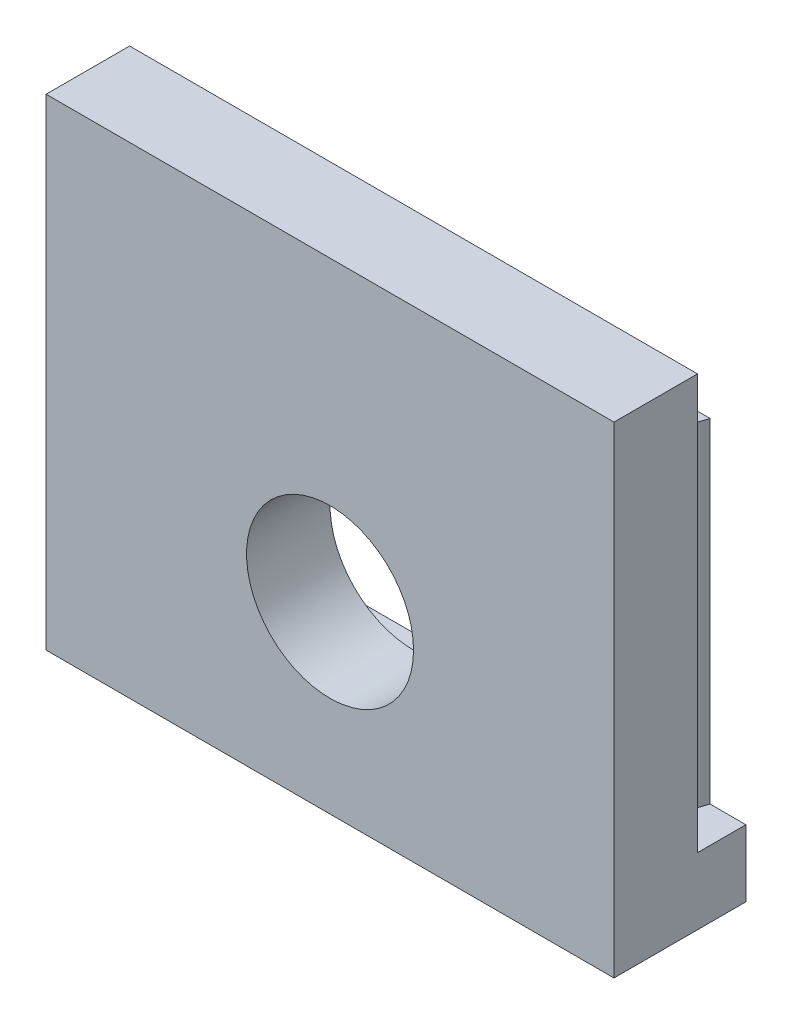
ISO-10303-21;
HEADER;
FILE_DESCRIPTION(('STEP AP214'),'2;1');
FILE_NAME('part.step','',(''),(''),'','','');
FILE_SCHEMA(('AUTOMOTIVE_DESIGN { 1 0 10303 214 1 1 1 1 }'));
ENDSEC;
DATA;
#1=APPLICATION_CONTEXT('core data for automotive mechanical design processes');
#2=APPLICATION_PROTOCOL_DEFINITION('international standard','automotive_design',2000,#1);
#3=PRODUCT_CONTEXT('',#1,'mechanical');
#4=PRODUCT('Part','Part','',(#3));
#5=PRODUCT_RELATED_PRODUCT_CATEGORY('part','',(#4));
#6=PRODUCT_DEFINITION_FORMATION('','',#4);
#7=PRODUCT_DEFINITION_CONTEXT('part definition',#1,'design');
#8=PRODUCT_DEFINITION('design','',#6,#7);
#9=PRODUCT_DEFINITION_SHAPE('','',#8);
#10=(LENGTH_UNIT() NAMED_UNIT(*) SI_UNIT(.MILLI.,.METRE.));
#11=(NAMED_UNIT(*) PLANE_ANGLE_UNIT() SI_UNIT($,.RADIAN.));
#12=(NAMED_UNIT(*) SI_UNIT($,.STERADIAN.) SOLID_ANGLE_UNIT());
#13=UNCERTAINTY_MEASURE_WITH_UNIT(LENGTH_MEASURE(1.E-05),#10,'distance_accuracy_value','');
#14=(GEOMETRIC_REPRESENTATION_CONTEXT(3) GLOBAL_UNCERTAINTY_ASSIGNED_CONTEXT((#13)) GLOBAL_UNIT_ASSIGNED_CONTEXT((#10,
#11,#12)) REPRESENTATION_CONTEXT('',''));
#15=CARTESIAN_POINT('',(0.,0.,0.));
#16=DIRECTION('',(0.,0.,1.));
#17=DIRECTION('',(1.,0.,0.));
#18=AXIS2_PLACEMENT_3D('',#15,#16,#17);
#19=CARTESIAN_POINT('',(-20.,-26.,-5.));
#20=DIRECTION('',(0.,-1.,0.));
#21=DIRECTION('',(0.,0.,-1.));
#22=AXIS2_PLACEMENT_3D('',#19,#20,#21);
#23=PLANE('',#22);
#24=DIRECTION('',(1.,0.,0.));
#25=VECTOR('',#24,1.);
#26=CARTESIAN_POINT('',(-20.,-26.,0.));
#27=LINE('',#26,#25);
#28=CARTESIAN_POINT('',(-17.0050160964288,-26.,0.));
#29=VERTEX_POINT('',#28);
#30=CARTESIAN_POINT('',(17.0050160964288,-26.,0.));
#31=VERTEX_POINT('',#30);
#32=EDGE_CURVE('E281',#29,#31,#27,.T.);
#33=ORIENTED_EDGE('',*,*,#32,.F.);
#34=DIRECTION('',(0.,0.,-1.));
#35=VECTOR('',#34,1.);
#36=CARTESIAN_POINT('',(-17.0050160964288,-26.,-5.));
#37=LINE('',#36,#35);
#38=CARTESIAN_POINT('',(-17.0050160964288,-26.,-7.90000000000003));
#39=VERTEX_POINT('',#38);
#40=EDGE_CURVE('E148',#29,#39,#37,.T.);
#41=ORIENTED_EDGE('',*,*,#40,.T.);
#42=DIRECTION('',(1.,0.,0.));
#43=VECTOR('',#42,1.);
#44=CARTESIAN_POINT('',(-20.,-26.,-7.90000000000003));
#45=LINE('',#44,#43);
#46=CARTESIAN_POINT('',(17.0050160964288,-26.,-7.90000000000003));
#47=VERTEX_POINT('',#46);
#48=EDGE_CURVE('E193',#39,#47,#45,.T.);
#49=ORIENTED_EDGE('',*,*,#48,.T.);
#50=DIRECTION('',(0.,0.,1.));
#51=VECTOR('',#50,1.);
#52=CARTESIAN_POINT('',(17.0050160964288,-26.,-5.));
#53=LINE('',#52,#51);
#54=EDGE_CURVE('E55',#47,#31,#53,.T.);
#55=ORIENTED_EDGE('',*,*,#54,.T.);
#56=EDGE_LOOP('',(#33,#41,#49,#55));
#57=FACE_BOUND('',#56,.T.);
#58=ADVANCED_FACE('F40',(#57),#23,.T.);
#59=CARTESIAN_POINT('',(17.2528036070203,-22.,-60.));
#60=DIRECTION('',(0.,-1.,0.));
#61=DIRECTION('',(1.,0.,0.));
#62=AXIS2_PLACEMENT_3D('',#59,#60,#61);
#63=PLANE('',#62);
#64=DIRECTION('',(0.,0.,-1.));
#65=VECTOR('',#64,1.);
#66=CARTESIAN_POINT('',(-17.0050160964288,-22.,-60.));
#67=LINE('',#66,#65);
#68=CARTESIAN_POINT('',(-17.0050160964288,-22.,-5.));
#69=VERTEX_POINT('',#68);
#70=CARTESIAN_POINT('',(-17.0050160964288,-22.,-7.90000000000003));
#71=VERTEX_POINT('',#70);
#72=EDGE_CURVE('E186',#69,#71,#67,.T.);
#73=ORIENTED_EDGE('',*,*,#72,.F.);
#74=DIRECTION('',(1.,0.,0.));
#75=VECTOR('',#74,1.);
#76=CARTESIAN_POINT('',(17.2528036070203,-22.,-5.));
#77=LINE('',#76,#75);
#78=CARTESIAN_POINT('',(-13.8945907446611,-22.,-5.00000000000003));
#79=VERTEX_POINT('',#78);
#80=EDGE_CURVE('E272',#69,#79,#77,.T.);
#81=ORIENTED_EDGE('',*,*,#80,.T.);
#82=DIRECTION('',(0.316227766016838,0.,0.948683298050514));
#83=VECTOR('',#82,1.);
#84=CARTESIAN_POINT('',(-13.8945907446611,-22.,-5.00000000000003));
#85=LINE('',#84,#83);
#86=CARTESIAN_POINT('',(-14.8612574113277,-22.,-7.90000000000003));
#87=VERTEX_POINT('',#86);
#88=EDGE_CURVE('E258',#87,#79,#85,.T.);
#89=ORIENTED_EDGE('',*,*,#88,.F.);
#90=DIRECTION('',(1.,0.,0.));
#91=VECTOR('',#90,1.);
#92=CARTESIAN_POINT('',(17.2528036070203,-22.,-7.90000000000003));
#93=LINE('',#92,#91);
#94=EDGE_CURVE('E197',#71,#87,#93,.T.);
#95=ORIENTED_EDGE('',*,*,#94,.F.);
#96=EDGE_LOOP('',(#73,#81,#89,#95));
#97=FACE_BOUND('',#96,.T.);
#98=ADVANCED_FACE('F295',(#97),#63,.F.);
#99=DIRECTION('',(0.,0.,1.));
#100=VECTOR('',#99,1.);
#101=CARTESIAN_POINT('',(17.0050160964288,-22.,-60.));
#102=LINE('',#101,#100);
#103=CARTESIAN_POINT('',(17.0050160964288,-22.,-7.90000000000003));
#104=VERTEX_POINT('',#103);
#105=CARTESIAN_POINT('',(17.0050160964288,-22.,-5.));
#106=VERTEX_POINT('',#105);
#107=EDGE_CURVE('E178',#104,#106,#102,.T.);
#108=ORIENTED_EDGE('',*,*,#107,.F.);
#109=CARTESIAN_POINT('',(14.8612574113277,-22.,-7.90000000000003));
#110=VERTEX_POINT('',#109);
#111=EDGE_CURVE('E200',#110,#104,#93,.T.);
#112=ORIENTED_EDGE('',*,*,#111,.F.);
#113=DIRECTION('',(0.316227766016838,0.,-0.948683298050514));
#114=VECTOR('',#113,1.);
#115=CARTESIAN_POINT('',(13.8945907446611,-22.,-5.));
#116=LINE('',#115,#114);
#117=CARTESIAN_POINT('',(13.8945907446611,-22.,-5.));
#118=VERTEX_POINT('',#117);
#119=EDGE_CURVE('E221',#118,#110,#116,.T.);
#120=ORIENTED_EDGE('',*,*,#119,.F.);
#121=EDGE_CURVE('E271',#118,#106,#77,.T.);
#122=ORIENTED_EDGE('',*,*,#121,.T.);
#123=EDGE_LOOP('',(#108,#112,#120,#122));
#124=FACE_BOUND('',#123,.T.);
#125=ADVANCED_FACE('F300',(#124),#63,.F.);
#126=CARTESIAN_POINT('',(0.,0.,-5.));
#127=DIRECTION('',(0.,0.,1.));
#128=DIRECTION('',(1.,0.,0.));
#129=AXIS2_PLACEMENT_3D('',#126,#127,#128);
#130=PLANE('',#129);
#131=CARTESIAN_POINT('',(0.,-15.,-5.));
#132=DIRECTION('',(0.,0.,1.));
#133=DIRECTION('',(1.,0.,0.));
#134=AXIS2_PLACEMENT_3D('',#131,#132,#133);
#135=CIRCLE('',#134,5.);
#136=CARTESIAN_POINT('',(5.00000000000002,-15.,-5.));
#137=VERTEX_POINT('',#136);
#138=EDGE_CURVE('E277',#137,#137,#135,.T.);
#139=ORIENTED_EDGE('',*,*,#138,.T.);
#140=EDGE_LOOP('',(#139));
#141=FACE_BOUND('',#140,.T.);
#142=DIRECTION('',(0.,-1.,0.));
#143=VECTOR('',#142,1.);
#144=CARTESIAN_POINT('',(-17.0050160964288,0.,-5.));
#145=LINE('',#144,#143);
#146=CARTESIAN_POINT('',(-17.0050160964288,2.83416934940476,-5.));
#147=VERTEX_POINT('',#146);
#148=EDGE_CURVE('E183',#147,#69,#145,.T.);
#149=ORIENTED_EDGE('',*,*,#148,.F.);
#150=DIRECTION('',(-1.,0.,0.));
#151=VECTOR('',#150,1.);
#152=CARTESIAN_POINT('',(0.,2.83416934940476,-5.));
#153=LINE('',#152,#151);
#154=CARTESIAN_POINT('',(17.0050160964288,2.83416934940476,-5.));
#155=VERTEX_POINT('',#154);
#156=EDGE_CURVE('E162',#155,#147,#153,.T.);
#157=ORIENTED_EDGE('',*,*,#156,.F.);
#158=DIRECTION('',(0.,1.,0.));
#159=VECTOR('',#158,1.);
#160=CARTESIAN_POINT('',(17.0050160964288,0.,-5.));
#161=LINE('',#160,#159);
#162=EDGE_CURVE('E174',#106,#155,#161,.T.);
#163=ORIENTED_EDGE('',*,*,#162,.F.);
#164=ORIENTED_EDGE('',*,*,#121,.F.);
#165=DIRECTION('',(0.,1.,0.));
#166=VECTOR('',#165,1.);
#167=CARTESIAN_POINT('',(13.8945907446611,-27.5418540444693,-5.));
#168=LINE('',#167,#166);
#169=CARTESIAN_POINT('',(13.8945907446611,-2.,-5.));
#170=VERTEX_POINT('',#169);
#171=EDGE_CURVE('E226',#118,#170,#168,.T.);
#172=ORIENTED_EDGE('',*,*,#171,.T.);
#173=DIRECTION('',(1.,0.,0.));
#174=VECTOR('',#173,1.);
#175=CARTESIAN_POINT('',(11.105409255339,-2.,-5.));
#176=LINE('',#175,#174);
#177=CARTESIAN_POINT('',(11.105409255339,-2.,-5.));
#178=VERTEX_POINT('',#177);
#179=EDGE_CURVE('E207',#178,#170,#176,.T.);
#180=ORIENTED_EDGE('',*,*,#179,.F.);
#181=DIRECTION('',(0.,1.,0.));
#182=VECTOR('',#181,1.);
#183=CARTESIAN_POINT('',(11.1054092553389,-27.5418540444693,-5.));
#184=LINE('',#183,#182);
#185=CARTESIAN_POINT('',(11.1054092553389,-22.,-5.));
#186=VERTEX_POINT('',#185);
#187=EDGE_CURVE('E220',#186,#178,#184,.T.);
#188=ORIENTED_EDGE('',*,*,#187,.F.);
#189=CARTESIAN_POINT('',(-11.105409255339,-22.,-4.99999999999999));
#190=VERTEX_POINT('',#189);
#191=EDGE_CURVE('E276',#190,#186,#77,.T.);
#192=ORIENTED_EDGE('',*,*,#191,.F.);
#193=DIRECTION('',(0.,1.,0.));
#194=VECTOR('',#193,1.);
#195=CARTESIAN_POINT('',(-11.105409255339,-27.5418540444693,-5.00000000000003));
#196=LINE('',#195,#194);
#197=CARTESIAN_POINT('',(-11.105409255339,-2.,-5.00000000000003));
#198=VERTEX_POINT('',#197);
#199=EDGE_CURVE('E63',#190,#198,#196,.T.);
#200=ORIENTED_EDGE('',*,*,#199,.T.);
#201=DIRECTION('',(1.,0.,0.));
#202=VECTOR('',#201,1.);
#203=CARTESIAN_POINT('',(-11.105409255339,-2.,-5.00000000000003));
#204=LINE('',#203,#202);
#205=CARTESIAN_POINT('',(-13.8945907446611,-2.,-5.00000000000003));
#206=VERTEX_POINT('',#205);
#207=EDGE_CURVE('E238',#206,#198,#204,.T.);
#208=ORIENTED_EDGE('',*,*,#207,.F.);
#209=DIRECTION('',(0.,1.,0.));
#210=VECTOR('',#209,1.);
#211=CARTESIAN_POINT('',(-13.8945907446611,-27.5418540444693,-5.00000000000003));
#212=LINE('',#211,#210);
#213=EDGE_CURVE('E262',#79,#206,#212,.T.);
#214=ORIENTED_EDGE('',*,*,#213,.F.);
#215=ORIENTED_EDGE('',*,*,#80,.F.);
#216=EDGE_LOOP('',(#149,#157,#163,#164,#172,#180,#188,#192,#200,#208,#214,#215));
#217=FACE_BOUND('',#216,.T.);
#218=ADVANCED_FACE('F307',(#141,#217),#130,.F.);
#219=CARTESIAN_POINT('',(0.,0.,0.));
#220=DIRECTION('',(0.,0.,1.));
#221=DIRECTION('',(1.,0.,0.));
#222=AXIS2_PLACEMENT_3D('',#219,#220,#221);
#223=PLANE('',#222);
#224=CARTESIAN_POINT('',(0.,-15.,0.));
#225=DIRECTION('',(0.,0.,1.));
#226=DIRECTION('',(1.,0.,0.));
#227=AXIS2_PLACEMENT_3D('',#224,#225,#226);
#228=CIRCLE('',#227,5.);
#229=CARTESIAN_POINT('',(5.00000000000002,-15.,0.));
#230=VERTEX_POINT('',#229);
#231=EDGE_CURVE('E275',#230,#230,#228,.T.);
#232=ORIENTED_EDGE('',*,*,#231,.F.);
#233=EDGE_LOOP('',(#232));
#234=FACE_BOUND('',#233,.T.);
#235=DIRECTION('',(1.,0.,0.));
#236=VECTOR('',#235,1.);
#237=CARTESIAN_POINT('',(17.0050160964288,2.83416934940476,0.));
#238=LINE('',#237,#236);
#239=CARTESIAN_POINT('',(-17.0050160964288,2.83416934940476,0.));
#240=VERTEX_POINT('',#239);
#241=CARTESIAN_POINT('',(17.0050160964288,2.83416934940476,0.));
#242=VERTEX_POINT('',#241);
#243=EDGE_CURVE('E154',#240,#242,#238,.T.);
#244=ORIENTED_EDGE('',*,*,#243,.F.);
#245=DIRECTION('',(0.,1.,0.));
#246=VECTOR('',#245,1.);
#247=CARTESIAN_POINT('',(-17.0050160964288,-28.3416934940481,0.));
#248=LINE('',#247,#246);
#249=EDGE_CURVE('E142',#29,#240,#248,.T.);
#250=ORIENTED_EDGE('',*,*,#249,.F.);
#251=ORIENTED_EDGE('',*,*,#32,.T.);
#252=DIRECTION('',(0.,-1.,0.));
#253=VECTOR('',#252,1.);
#254=CARTESIAN_POINT('',(17.0050160964288,-28.3416934940481,0.));
#255=LINE('',#254,#253);
#256=EDGE_CURVE('E165',#242,#31,#255,.T.);
#257=ORIENTED_EDGE('',*,*,#256,.F.);
#258=EDGE_LOOP('',(#244,#250,#251,#257));
#259=FACE_BOUND('',#258,.T.);
#260=ADVANCED_FACE('F167',(#234,#259),#223,.T.);
#261=CARTESIAN_POINT('',(-14.8612574113277,-27.5418540444693,-7.90000000000003));
#262=DIRECTION('',(0.,0.,-1.));
#263=DIRECTION('',(-1.,0.,0.));
#264=AXIS2_PLACEMENT_3D('',#261,#262,#263);
#265=PLANE('',#264);
#266=ORIENTED_EDGE('',*,*,#48,.F.);
#267=DIRECTION('',(0.,1.,0.));
#268=VECTOR('',#267,1.);
#269=CARTESIAN_POINT('',(-17.0050160964288,-27.5418540444693,-7.90000000000003));
#270=LINE('',#269,#268);
#271=EDGE_CURVE('E11',#39,#71,#270,.T.);
#272=ORIENTED_EDGE('',*,*,#271,.T.);
#273=ORIENTED_EDGE('',*,*,#94,.T.);
#274=DIRECTION('',(0.,1.,0.));
#275=VECTOR('',#274,1.);
#276=CARTESIAN_POINT('',(-14.8612574113277,-27.5418540444693,-7.90000000000003));
#277=LINE('',#276,#275);
#278=CARTESIAN_POINT('',(-14.8612574113277,-2.,-7.90000000000003));
#279=VERTEX_POINT('',#278);
#280=EDGE_CURVE('E242',#87,#279,#277,.T.);
#281=ORIENTED_EDGE('',*,*,#280,.T.);
#282=DIRECTION('',(-1.,0.,0.));
#283=VECTOR('',#282,1.);
#284=CARTESIAN_POINT('',(-14.8612574113277,-2.,-7.90000000000003));
#285=LINE('',#284,#283);
#286=CARTESIAN_POINT('',(-10.1387425886723,-2.,-7.90000000000003));
#287=VERTEX_POINT('',#286);
#288=EDGE_CURVE('E247',#287,#279,#285,.T.);
#289=ORIENTED_EDGE('',*,*,#288,.F.);
#290=DIRECTION('',(0.,1.,0.));
#291=VECTOR('',#290,1.);
#292=CARTESIAN_POINT('',(-10.1387425886723,-27.5418540444693,-7.90000000000003));
#293=LINE('',#292,#291);
#294=CARTESIAN_POINT('',(-10.1387425886723,-22.,-7.90000000000003));
#295=VERTEX_POINT('',#294);
#296=EDGE_CURVE('E257',#295,#287,#293,.T.);
#297=ORIENTED_EDGE('',*,*,#296,.F.);
#298=CARTESIAN_POINT('',(10.1387425886723,-22.,-7.90000000000003));
#299=VERTEX_POINT('',#298);
#300=EDGE_CURVE('E201',#295,#299,#93,.T.);
#301=ORIENTED_EDGE('',*,*,#300,.T.);
#302=DIRECTION('',(0.,1.,0.));
#303=VECTOR('',#302,1.);
#304=CARTESIAN_POINT('',(10.1387425886723,-27.5418540444693,-7.9));
#305=LINE('',#304,#303);
#306=CARTESIAN_POINT('',(10.1387425886723,-2.,-7.9));
#307=VERTEX_POINT('',#306);
#308=EDGE_CURVE('E229',#299,#307,#305,.T.);
#309=ORIENTED_EDGE('',*,*,#308,.T.);
#310=DIRECTION('',(-1.,0.,0.));
#311=VECTOR('',#310,1.);
#312=CARTESIAN_POINT('',(14.8612574113277,-2.,-7.9));
#313=LINE('',#312,#311);
#314=CARTESIAN_POINT('',(14.8612574113277,-2.,-7.9));
#315=VERTEX_POINT('',#314);
#316=EDGE_CURVE('E214',#315,#307,#313,.T.);
#317=ORIENTED_EDGE('',*,*,#316,.F.);
#318=DIRECTION('',(0.,1.,0.));
#319=VECTOR('',#318,1.);
#320=CARTESIAN_POINT('',(14.8612574113277,-27.5418540444693,-7.9));
#321=LINE('',#320,#319);
#322=EDGE_CURVE('E225',#110,#315,#321,.T.);
#323=ORIENTED_EDGE('',*,*,#322,.F.);
#324=ORIENTED_EDGE('',*,*,#111,.T.);
#325=DIRECTION('',(0.,-1.,0.));
#326=VECTOR('',#325,1.);
#327=CARTESIAN_POINT('',(17.0050160964288,-27.5418540444693,-7.90000000000003));
#328=LINE('',#327,#326);
#329=EDGE_CURVE('E48',#104,#47,#328,.T.);
#330=ORIENTED_EDGE('',*,*,#329,.T.);
#331=EDGE_LOOP('',(#266,#272,#273,#281,#289,#297,#301,#309,#317,#323,#324,#330));
#332=FACE_BOUND('',#331,.T.);
#333=ADVANCED_FACE('F290',(#332),#265,.T.);
#334=ORIENTED_EDGE('',*,*,#300,.F.);
#335=DIRECTION('',(0.316227766016838,0.,-0.948683298050514));
#336=VECTOR('',#335,1.);
#337=CARTESIAN_POINT('',(-11.105409255339,-22.,-5.00000000000003));
#338=LINE('',#337,#336);
#339=EDGE_CURVE('E254',#190,#295,#338,.T.);
#340=ORIENTED_EDGE('',*,*,#339,.F.);
#341=ORIENTED_EDGE('',*,*,#191,.T.);
#342=DIRECTION('',(0.316227766016838,0.,0.948683298050514));
#343=VECTOR('',#342,1.);
#344=CARTESIAN_POINT('',(11.1054092553389,-22.,-5.));
#345=LINE('',#344,#343);
#346=EDGE_CURVE('E206',#299,#186,#345,.T.);
#347=ORIENTED_EDGE('',*,*,#346,.F.);
#348=EDGE_LOOP('',(#334,#340,#341,#347));
#349=FACE_BOUND('',#348,.T.);
#350=ADVANCED_FACE('F303',(#349),#63,.F.);
#351=CARTESIAN_POINT('',(0.,-15.,-5.));
#352=DIRECTION('',(0.,0.,1.));
#353=DIRECTION('',(1.,0.,0.));
#354=AXIS2_PLACEMENT_3D('',#351,#352,#353);
#355=CYLINDRICAL_SURFACE('',#354,5.);
#356=ORIENTED_EDGE('',*,*,#138,.F.);
#357=EDGE_LOOP('',(#356));
#358=FACE_BOUND('',#357,.T.);
#359=ORIENTED_EDGE('',*,*,#231,.T.);
#360=EDGE_LOOP('',(#359));
#361=FACE_BOUND('',#360,.T.);
#362=ADVANCED_FACE('F313',(#358,#361),#355,.F.);
#363=CARTESIAN_POINT('',(0.,-2.,0.));
#364=DIRECTION('',(0.,-1.,0.));
#365=DIRECTION('',(0.,0.,-1.));
#366=AXIS2_PLACEMENT_3D('',#363,#364,#365);
#367=PLANE('',#366);
#368=DIRECTION('',(0.316227766016838,0.,-0.948683298050514));
#369=VECTOR('',#368,1.);
#370=CARTESIAN_POINT('',(-11.105409255339,-2.,-5.00000000000003));
#371=LINE('',#370,#369);
#372=EDGE_CURVE('E237',#198,#287,#371,.T.);
#373=ORIENTED_EDGE('',*,*,#372,.T.);
#374=ORIENTED_EDGE('',*,*,#288,.T.);
#375=DIRECTION('',(0.316227766016838,0.,0.948683298050514));
#376=VECTOR('',#375,1.);
#377=CARTESIAN_POINT('',(-13.8945907446611,-2.,-5.00000000000003));
#378=LINE('',#377,#376);
#379=EDGE_CURVE('E243',#279,#206,#378,.T.);
#380=ORIENTED_EDGE('',*,*,#379,.T.);
#381=ORIENTED_EDGE('',*,*,#207,.T.);
#382=EDGE_LOOP('',(#373,#374,#380,#381));
#383=FACE_BOUND('',#382,.T.);
#384=ADVANCED_FACE('F320',(#383),#367,.F.);
#385=CARTESIAN_POINT('',(-13.8945907446611,-27.5418540444693,-5.00000000000003));
#386=DIRECTION('',(-0.948683298050514,0.,0.316227766016838));
#387=DIRECTION('',(0.316227766016838,0.,0.948683298050514));
#388=AXIS2_PLACEMENT_3D('',#385,#386,#387);
#389=PLANE('',#388);
#390=ORIENTED_EDGE('',*,*,#280,.F.);
#391=ORIENTED_EDGE('',*,*,#88,.T.);
#392=ORIENTED_EDGE('',*,*,#213,.T.);
#393=ORIENTED_EDGE('',*,*,#379,.F.);
#394=EDGE_LOOP('',(#390,#391,#392,#393));
#395=FACE_BOUND('',#394,.T.);
#396=ADVANCED_FACE('F368',(#395),#389,.T.);
#397=CARTESIAN_POINT('',(-11.105409255339,-27.5418540444693,-5.00000000000003));
#398=DIRECTION('',(0.948683298050514,0.,0.316227766016838));
#399=DIRECTION('',(0.316227766016838,0.,-0.948683298050514));
#400=AXIS2_PLACEMENT_3D('',#397,#398,#399);
#401=PLANE('',#400);
#402=ORIENTED_EDGE('',*,*,#199,.F.);
#403=ORIENTED_EDGE('',*,*,#339,.T.);
#404=ORIENTED_EDGE('',*,*,#296,.T.);
#405=ORIENTED_EDGE('',*,*,#372,.F.);
#406=EDGE_LOOP('',(#402,#403,#404,#405));
#407=FACE_BOUND('',#406,.T.);
#408=ADVANCED_FACE('F329',(#407),#401,.T.);
#409=CARTESIAN_POINT('',(0.,-2.,0.));
#410=DIRECTION('',(0.,-1.,0.));
#411=DIRECTION('',(0.,0.,-1.));
#412=AXIS2_PLACEMENT_3D('',#409,#410,#411);
#413=PLANE('',#412);
#414=ORIENTED_EDGE('',*,*,#316,.T.);
#415=DIRECTION('',(0.316227766016838,0.,0.948683298050514));
#416=VECTOR('',#415,1.);
#417=CARTESIAN_POINT('',(11.105409255339,-2.,-5.));
#418=LINE('',#417,#416);
#419=EDGE_CURVE('E210',#307,#178,#418,.T.);
#420=ORIENTED_EDGE('',*,*,#419,.T.);
#421=ORIENTED_EDGE('',*,*,#179,.T.);
#422=DIRECTION('',(0.316227766016838,0.,-0.948683298050514));
#423=VECTOR('',#422,1.);
#424=CARTESIAN_POINT('',(13.8945907446611,-2.,-5.));
#425=LINE('',#424,#423);
#426=EDGE_CURVE('E202',#170,#315,#425,.T.);
#427=ORIENTED_EDGE('',*,*,#426,.T.);
#428=EDGE_LOOP('',(#414,#420,#421,#427));
#429=FACE_BOUND('',#428,.T.);
#430=ADVANCED_FACE('F356',(#429),#413,.F.);
#431=CARTESIAN_POINT('',(11.1054092553389,-27.5418540444693,-5.));
#432=DIRECTION('',(-0.948683298050514,0.,0.316227766016838));
#433=DIRECTION('',(0.316227766016838,0.,0.948683298050514));
#434=AXIS2_PLACEMENT_3D('',#431,#432,#433);
#435=PLANE('',#434);
#436=ORIENTED_EDGE('',*,*,#308,.F.);
#437=ORIENTED_EDGE('',*,*,#346,.T.);
#438=ORIENTED_EDGE('',*,*,#187,.T.);
#439=ORIENTED_EDGE('',*,*,#419,.F.);
#440=EDGE_LOOP('',(#436,#437,#438,#439));
#441=FACE_BOUND('',#440,.T.);
#442=ADVANCED_FACE('F359',(#441),#435,.T.);
#443=CARTESIAN_POINT('',(13.8945907446611,-27.5418540444693,-5.));
#444=DIRECTION('',(0.948683298050514,0.,0.316227766016838));
#445=DIRECTION('',(0.316227766016838,0.,-0.948683298050514));
#446=AXIS2_PLACEMENT_3D('',#443,#444,#445);
#447=PLANE('',#446);
#448=ORIENTED_EDGE('',*,*,#171,.F.);
#449=ORIENTED_EDGE('',*,*,#119,.T.);
#450=ORIENTED_EDGE('',*,*,#322,.T.);
#451=ORIENTED_EDGE('',*,*,#426,.F.);
#452=EDGE_LOOP('',(#448,#449,#450,#451));
#453=FACE_BOUND('',#452,.T.);
#454=ADVANCED_FACE('F354',(#453),#447,.T.);
#455=CARTESIAN_POINT('',(17.0050160964288,2.83416934940476,0.));
#456=DIRECTION('',(0.,1.,0.));
#457=DIRECTION('',(0.,0.,1.));
#458=AXIS2_PLACEMENT_3D('',#455,#456,#457);
#459=PLANE('',#458);
#460=ORIENTED_EDGE('',*,*,#156,.T.);
#461=DIRECTION('',(0.,0.,-1.));
#462=VECTOR('',#461,1.);
#463=CARTESIAN_POINT('',(-17.0050160964288,2.83416934940476,0.));
#464=LINE('',#463,#462);
#465=EDGE_CURVE('E145',#240,#147,#464,.T.);
#466=ORIENTED_EDGE('',*,*,#465,.F.);
#467=ORIENTED_EDGE('',*,*,#243,.T.);
#468=DIRECTION('',(0.,0.,-1.));
#469=VECTOR('',#468,1.);
#470=CARTESIAN_POINT('',(17.0050160964288,2.83416934940476,0.));
#471=LINE('',#470,#469);
#472=EDGE_CURVE('E164',#242,#155,#471,.T.);
#473=ORIENTED_EDGE('',*,*,#472,.T.);
#474=EDGE_LOOP('',(#460,#466,#467,#473));
#475=FACE_BOUND('',#474,.T.);
#476=ADVANCED_FACE('F158',(#475),#459,.T.);
#477=CARTESIAN_POINT('',(-17.0050160964288,-28.3416934940481,0.));
#478=DIRECTION('',(-1.,0.,0.));
#479=DIRECTION('',(0.,0.,1.));
#480=AXIS2_PLACEMENT_3D('',#477,#478,#479);
#481=PLANE('',#480);
#482=ORIENTED_EDGE('',*,*,#249,.T.);
#483=ORIENTED_EDGE('',*,*,#465,.T.);
#484=ORIENTED_EDGE('',*,*,#148,.T.);
#485=ORIENTED_EDGE('',*,*,#72,.T.);
#486=ORIENTED_EDGE('',*,*,#271,.F.);
#487=ORIENTED_EDGE('',*,*,#40,.F.);
#488=EDGE_LOOP('',(#482,#483,#484,#485,#486,#487));
#489=FACE_BOUND('',#488,.T.);
#490=ADVANCED_FACE('F144',(#489),#481,.T.);
#491=CARTESIAN_POINT('',(17.0050160964288,-28.3416934940481,0.));
#492=DIRECTION('',(1.,0.,0.));
#493=DIRECTION('',(0.,0.,-1.));
#494=AXIS2_PLACEMENT_3D('',#491,#492,#493);
#495=PLANE('',#494);
#496=ORIENTED_EDGE('',*,*,#329,.F.);
#497=ORIENTED_EDGE('',*,*,#107,.T.);
#498=ORIENTED_EDGE('',*,*,#162,.T.);
#499=ORIENTED_EDGE('',*,*,#472,.F.);
#500=ORIENTED_EDGE('',*,*,#256,.T.);
#501=ORIENTED_EDGE('',*,*,#54,.F.);
#502=EDGE_LOOP('',(#496,#497,#498,#499,#500,#501));
#503=FACE_BOUND('',#502,.T.);
#504=ADVANCED_FACE('F345',(#503),#495,.T.);
#505=CLOSED_SHELL('',(#58,#98,#125,#218,#260,#333,#350,#362,#384,#396,#408,#430,#442,#454,#476,
#490,#504));
#506=MANIFOLD_SOLID_BREP('B2',#505);
#507=ADVANCED_BREP_SHAPE_REPRESENTATION('',(#18,#506),#14);
#508=SHAPE_DEFINITION_REPRESENTATION(#9,#507);
ENDSEC;
END-ISO-10303-21;
